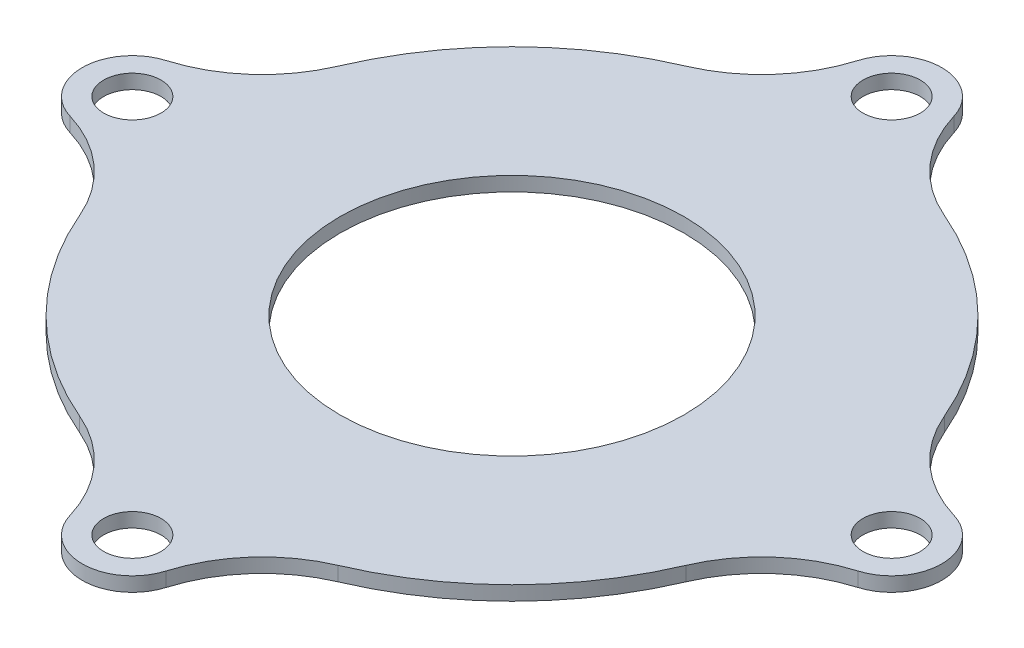
ISO-10303-21;
HEADER;
FILE_DESCRIPTION(('STEP AP214'),'2;1');
FILE_NAME('part.step','',(''),(''),'','','');
FILE_SCHEMA(('AUTOMOTIVE_DESIGN { 1 0 10303 214 1 1 1 1 }'));
ENDSEC;
DATA;
#1=APPLICATION_CONTEXT('core data for automotive mechanical design processes');
#2=APPLICATION_PROTOCOL_DEFINITION('international standard','automotive_design',2000,#1);
#3=PRODUCT_CONTEXT('',#1,'mechanical');
#4=PRODUCT('Part','Part','',(#3));
#5=PRODUCT_RELATED_PRODUCT_CATEGORY('part','',(#4));
#6=PRODUCT_DEFINITION_FORMATION('','',#4);
#7=PRODUCT_DEFINITION_CONTEXT('part definition',#1,'design');
#8=PRODUCT_DEFINITION('design','',#6,#7);
#9=PRODUCT_DEFINITION_SHAPE('','',#8);
#10=(LENGTH_UNIT() NAMED_UNIT(*) SI_UNIT(.MILLI.,.METRE.));
#11=(NAMED_UNIT(*) PLANE_ANGLE_UNIT() SI_UNIT($,.RADIAN.));
#12=(NAMED_UNIT(*) SI_UNIT($,.STERADIAN.) SOLID_ANGLE_UNIT());
#13=UNCERTAINTY_MEASURE_WITH_UNIT(LENGTH_MEASURE(1.E-05),#10,'distance_accuracy_value','');
#14=(GEOMETRIC_REPRESENTATION_CONTEXT(3) GLOBAL_UNCERTAINTY_ASSIGNED_CONTEXT((#13)) GLOBAL_UNIT_ASSIGNED_CONTEXT((#10,
#11,#12)) REPRESENTATION_CONTEXT('',''));
#15=CARTESIAN_POINT('',(0.,0.,0.));
#16=DIRECTION('',(0.,0.,1.));
#17=DIRECTION('',(1.,0.,0.));
#18=AXIS2_PLACEMENT_3D('',#15,#16,#17);
#19=CARTESIAN_POINT('',(0.,3.,0.));
#20=DIRECTION('',(0.,-1.,0.));
#21=DIRECTION('',(0.,0.,-1.));
#22=AXIS2_PLACEMENT_3D('',#19,#20,#21);
#23=CYLINDRICAL_SURFACE('',#22,23.);
#24=CARTESIAN_POINT('',(0.,1.,0.));
#25=DIRECTION('',(0.,1.,0.));
#26=DIRECTION('',(0.,0.,1.));
#27=AXIS2_PLACEMENT_3D('',#24,#25,#26);
#28=CIRCLE('',#27,23.);
#29=CARTESIAN_POINT('',(-21.1589479702687,1.,-9.01659141757354));
#30=VERTEX_POINT('',#29);
#31=CARTESIAN_POINT('',(-9.01659141757377,0.999999999999973,-21.1589479702686));
#32=VERTEX_POINT('',#31);
#33=EDGE_CURVE('E153',#30,#32,#28,.F.);
#34=ORIENTED_EDGE('',*,*,#33,.T.);
#35=DIRECTION('',(0.,-1.,0.));
#36=VECTOR('',#35,1.);
#37=CARTESIAN_POINT('',(-9.01659141757377,3.,-21.1589479702686));
#38=LINE('',#37,#36);
#39=CARTESIAN_POINT('',(-9.01659141757377,0.,-21.1589479702686));
#40=VERTEX_POINT('',#39);
#41=EDGE_CURVE('E166',#32,#40,#38,.T.);
#42=ORIENTED_EDGE('',*,*,#41,.T.);
#43=CARTESIAN_POINT('',(0.,0.,0.));
#44=DIRECTION('',(0.,1.,0.));
#45=DIRECTION('',(0.,0.,1.));
#46=AXIS2_PLACEMENT_3D('',#43,#44,#45);
#47=CIRCLE('',#46,23.);
#48=CARTESIAN_POINT('',(-21.1589479702687,0.,-9.01659141757355));
#49=VERTEX_POINT('',#48);
#50=EDGE_CURVE('E266',#40,#49,#47,.T.);
#51=ORIENTED_EDGE('',*,*,#50,.T.);
#52=DIRECTION('',(0.,-1.,0.));
#53=VECTOR('',#52,1.);
#54=CARTESIAN_POINT('',(-21.1589479702687,3.,-9.01659141757355));
#55=LINE('',#54,#53);
#56=EDGE_CURVE('E169',#49,#30,#55,.F.);
#57=ORIENTED_EDGE('',*,*,#56,.T.);
#58=EDGE_LOOP('',(#34,#42,#51,#57));
#59=FACE_BOUND('',#58,.T.);
#60=ADVANCED_FACE('F38',(#59),#23,.T.);
#61=CARTESIAN_POINT('',(0.,1.,0.));
#62=DIRECTION('',(0.,1.,0.));
#63=DIRECTION('',(0.,0.,1.));
#64=AXIS2_PLACEMENT_3D('',#61,#62,#63);
#65=CIRCLE('',#64,23.);
#66=CARTESIAN_POINT('',(9.01659141757332,1.,-21.1589479702688));
#67=VERTEX_POINT('',#66);
#68=CARTESIAN_POINT('',(21.1589479702687,1.,-9.01659141757369));
#69=VERTEX_POINT('',#68);
#70=EDGE_CURVE('E248',#67,#69,#65,.F.);
#71=ORIENTED_EDGE('',*,*,#70,.T.);
#72=DIRECTION('',(0.,-1.,0.));
#73=VECTOR('',#72,1.);
#74=CARTESIAN_POINT('',(21.1589479702687,3.,-9.0165914175737));
#75=LINE('',#74,#73);
#76=CARTESIAN_POINT('',(21.1589479702687,0.,-9.01659141757369));
#77=VERTEX_POINT('',#76);
#78=EDGE_CURVE('E287',#69,#77,#75,.T.);
#79=ORIENTED_EDGE('',*,*,#78,.T.);
#80=CARTESIAN_POINT('',(9.01659141757333,0.,-21.1589479702688));
#81=VERTEX_POINT('',#80);
#82=EDGE_CURVE('E300',#77,#81,#47,.T.);
#83=ORIENTED_EDGE('',*,*,#82,.T.);
#84=DIRECTION('',(0.,-1.,0.));
#85=VECTOR('',#84,1.);
#86=CARTESIAN_POINT('',(9.01659141757333,3.,-21.1589479702688));
#87=LINE('',#86,#85);
#88=EDGE_CURVE('E284',#81,#67,#87,.F.);
#89=ORIENTED_EDGE('',*,*,#88,.T.);
#90=EDGE_LOOP('',(#71,#79,#83,#89));
#91=FACE_BOUND('',#90,.T.);
#92=ADVANCED_FACE('F321',(#91),#23,.T.);
#93=CARTESIAN_POINT('',(0.,1.,0.));
#94=DIRECTION('',(0.,1.,0.));
#95=DIRECTION('',(0.,0.,1.));
#96=AXIS2_PLACEMENT_3D('',#93,#94,#95);
#97=CIRCLE('',#96,23.);
#98=CARTESIAN_POINT('',(21.1589479702688,1.,9.0165914175734));
#99=VERTEX_POINT('',#98);
#100=CARTESIAN_POINT('',(9.01659141757363,1.,21.1589479702687));
#101=VERTEX_POINT('',#100);
#102=EDGE_CURVE('E236',#99,#101,#97,.F.);
#103=ORIENTED_EDGE('',*,*,#102,.T.);
#104=DIRECTION('',(0.,-1.,0.));
#105=VECTOR('',#104,1.);
#106=CARTESIAN_POINT('',(9.01659141757362,3.,21.1589479702687));
#107=LINE('',#106,#105);
#108=CARTESIAN_POINT('',(9.01659141757362,0.,21.1589479702687));
#109=VERTEX_POINT('',#108);
#110=EDGE_CURVE('E272',#101,#109,#107,.T.);
#111=ORIENTED_EDGE('',*,*,#110,.T.);
#112=CARTESIAN_POINT('',(21.1589479702688,0.,9.0165914175734));
#113=VERTEX_POINT('',#112);
#114=EDGE_CURVE('E269',#109,#113,#47,.T.);
#115=ORIENTED_EDGE('',*,*,#114,.T.);
#116=DIRECTION('',(0.,-1.,0.));
#117=VECTOR('',#116,1.);
#118=CARTESIAN_POINT('',(21.1589479702688,3.,9.0165914175734));
#119=LINE('',#118,#117);
#120=EDGE_CURVE('E268',#113,#99,#119,.F.);
#121=ORIENTED_EDGE('',*,*,#120,.T.);
#122=EDGE_LOOP('',(#103,#111,#115,#121));
#123=FACE_BOUND('',#122,.T.);
#124=ADVANCED_FACE('F306',(#123),#23,.T.);
#125=CARTESIAN_POINT('',(0.,1.,0.));
#126=DIRECTION('',(0.,1.,0.));
#127=DIRECTION('',(0.,0.,1.));
#128=AXIS2_PLACEMENT_3D('',#125,#126,#127);
#129=CIRCLE('',#128,23.);
#130=CARTESIAN_POINT('',(-9.01659141757347,1.,21.1589479702688));
#131=VERTEX_POINT('',#130);
#132=CARTESIAN_POINT('',(-21.1589479702687,1.,9.01659141757353));
#133=VERTEX_POINT('',#132);
#134=EDGE_CURVE('E53',#131,#133,#129,.F.);
#135=ORIENTED_EDGE('',*,*,#134,.T.);
#136=DIRECTION('',(0.,-1.,0.));
#137=VECTOR('',#136,1.);
#138=CARTESIAN_POINT('',(-21.1589479702687,3.,9.01659141757355));
#139=LINE('',#138,#137);
#140=CARTESIAN_POINT('',(-21.1589479702687,0.,9.01659141757355));
#141=VERTEX_POINT('',#140);
#142=EDGE_CURVE('E189',#133,#141,#139,.T.);
#143=ORIENTED_EDGE('',*,*,#142,.T.);
#144=CARTESIAN_POINT('',(-9.01659141757347,0.,21.1589479702688));
#145=VERTEX_POINT('',#144);
#146=EDGE_CURVE('E207',#141,#145,#47,.T.);
#147=ORIENTED_EDGE('',*,*,#146,.T.);
#148=DIRECTION('',(0.,-1.,0.));
#149=VECTOR('',#148,1.);
#150=CARTESIAN_POINT('',(-9.01659141757347,3.,21.1589479702688));
#151=LINE('',#150,#149);
#152=EDGE_CURVE('E186',#145,#131,#151,.F.);
#153=ORIENTED_EDGE('',*,*,#152,.T.);
#154=EDGE_LOOP('',(#135,#143,#147,#153));
#155=FACE_BOUND('',#154,.T.);
#156=ADVANCED_FACE('F328',(#155),#23,.T.);
#157=CARTESIAN_POINT('',(0.,10.,0.));
#158=DIRECTION('',(0.,-1.,0.));
#159=DIRECTION('',(0.,0.,-1.));
#160=AXIS2_PLACEMENT_3D('',#157,#158,#159);
#161=CYLINDRICAL_SURFACE('',#160,12.);
#162=CARTESIAN_POINT('',(0.,0.,0.));
#163=DIRECTION('',(0.,-1.,0.));
#164=DIRECTION('',(0.,0.,-1.));
#165=AXIS2_PLACEMENT_3D('',#162,#163,#164);
#166=CIRCLE('',#165,12.);
#167=CARTESIAN_POINT('',(0.,0.,-12.));
#168=VERTEX_POINT('',#167);
#169=EDGE_CURVE('E216',#168,#168,#166,.T.);
#170=ORIENTED_EDGE('',*,*,#169,.T.);
#171=EDGE_LOOP('',(#170));
#172=FACE_BOUND('',#171,.T.);
#173=CARTESIAN_POINT('',(0.,0.999999999999999,0.));
#174=DIRECTION('',(0.,1.,0.));
#175=DIRECTION('',(0.,0.,1.));
#176=AXIS2_PLACEMENT_3D('',#173,#174,#175);
#177=CIRCLE('',#176,12.);
#178=CARTESIAN_POINT('',(0.,0.999999999999999,12.));
#179=VERTEX_POINT('',#178);
#180=EDGE_CURVE('E161',#179,#179,#177,.F.);
#181=ORIENTED_EDGE('',*,*,#180,.F.);
#182=EDGE_LOOP('',(#181));
#183=FACE_BOUND('',#182,.T.);
#184=ADVANCED_FACE('F360',(#172,#183),#161,.F.);
#185=CARTESIAN_POINT('',(-26.5,3.,0.));
#186=DIRECTION('',(0.,-1.,0.));
#187=DIRECTION('',(0.,0.,-1.));
#188=AXIS2_PLACEMENT_3D('',#185,#186,#187);
#189=CYLINDRICAL_SURFACE('',#188,3.5);
#190=DIRECTION('',(0.,-1.,0.));
#191=VECTOR('',#190,1.);
#192=CARTESIAN_POINT('',(-27.5003494060098,3.,3.35399777368678));
#193=LINE('',#192,#191);
#194=CARTESIAN_POINT('',(-27.5003494060098,0.,3.35399777368678));
#195=VERTEX_POINT('',#194);
#196=CARTESIAN_POINT('',(-27.5003494060098,1.,3.35399777368677));
#197=VERTEX_POINT('',#196);
#198=EDGE_CURVE('E176',#195,#197,#193,.F.);
#199=ORIENTED_EDGE('',*,*,#198,.T.);
#200=CARTESIAN_POINT('',(-26.5,1.,0.));
#201=DIRECTION('',(0.,1.,0.));
#202=DIRECTION('',(0.,0.,1.));
#203=AXIS2_PLACEMENT_3D('',#200,#201,#202);
#204=CIRCLE('',#203,3.5);
#205=CARTESIAN_POINT('',(-27.5003494060098,1.,-3.35399777368678));
#206=VERTEX_POINT('',#205);
#207=EDGE_CURVE('E222',#197,#206,#204,.F.);
#208=ORIENTED_EDGE('',*,*,#207,.T.);
#209=DIRECTION('',(0.,-1.,0.));
#210=VECTOR('',#209,1.);
#211=CARTESIAN_POINT('',(-27.5003494060098,3.,-3.35399777368678));
#212=LINE('',#211,#210);
#213=CARTESIAN_POINT('',(-27.5003494060098,0.,-3.35399777368678));
#214=VERTEX_POINT('',#213);
#215=EDGE_CURVE('E179',#206,#214,#212,.T.);
#216=ORIENTED_EDGE('',*,*,#215,.T.);
#217=CARTESIAN_POINT('',(-26.5,0.,0.));
#218=DIRECTION('',(0.,-1.,0.));
#219=DIRECTION('',(0.,0.,-1.));
#220=AXIS2_PLACEMENT_3D('',#217,#218,#219);
#221=CIRCLE('',#220,3.5);
#222=EDGE_CURVE('E206',#195,#214,#221,.T.);
#223=ORIENTED_EDGE('',*,*,#222,.F.);
#224=EDGE_LOOP('',(#199,#208,#216,#223));
#225=FACE_BOUND('',#224,.T.);
#226=ADVANCED_FACE('F212',(#225),#189,.T.);
#227=CARTESIAN_POINT('',(0.,3.,26.5));
#228=DIRECTION('',(0.,-1.,0.));
#229=DIRECTION('',(0.,0.,-1.));
#230=AXIS2_PLACEMENT_3D('',#227,#228,#229);
#231=CYLINDRICAL_SURFACE('',#230,3.5);
#232=DIRECTION('',(0.,-1.,0.));
#233=VECTOR('',#232,1.);
#234=CARTESIAN_POINT('',(3.35399777368688,3.,27.5003494060098));
#235=LINE('',#234,#233);
#236=CARTESIAN_POINT('',(3.35399777368688,0.,27.5003494060098));
#237=VERTEX_POINT('',#236);
#238=CARTESIAN_POINT('',(3.35399777368688,1.,27.5003494060098));
#239=VERTEX_POINT('',#238);
#240=EDGE_CURVE('E276',#237,#239,#235,.F.);
#241=ORIENTED_EDGE('',*,*,#240,.T.);
#242=CARTESIAN_POINT('',(0.,1.,26.5));
#243=DIRECTION('',(0.,1.,0.));
#244=DIRECTION('',(0.,0.,1.));
#245=AXIS2_PLACEMENT_3D('',#242,#243,#244);
#246=CIRCLE('',#245,3.5);
#247=CARTESIAN_POINT('',(-3.35399777368668,1.,27.5003494060098));
#248=VERTEX_POINT('',#247);
#249=EDGE_CURVE('E230',#239,#248,#246,.F.);
#250=ORIENTED_EDGE('',*,*,#249,.T.);
#251=DIRECTION('',(0.,-1.,0.));
#252=VECTOR('',#251,1.);
#253=CARTESIAN_POINT('',(-3.35399777368668,3.,27.5003494060098));
#254=LINE('',#253,#252);
#255=CARTESIAN_POINT('',(-3.35399777368668,0.,27.5003494060098));
#256=VERTEX_POINT('',#255);
#257=EDGE_CURVE('E274',#248,#256,#254,.T.);
#258=ORIENTED_EDGE('',*,*,#257,.T.);
#259=CARTESIAN_POINT('',(0.,0.,26.5));
#260=DIRECTION('',(0.,-1.,0.));
#261=DIRECTION('',(0.,0.,-1.));
#262=AXIS2_PLACEMENT_3D('',#259,#260,#261);
#263=CIRCLE('',#262,3.5);
#264=EDGE_CURVE('E217',#237,#256,#263,.T.);
#265=ORIENTED_EDGE('',*,*,#264,.F.);
#266=EDGE_LOOP('',(#241,#250,#258,#265));
#267=FACE_BOUND('',#266,.T.);
#268=ADVANCED_FACE('F368',(#267),#231,.T.);
#269=CARTESIAN_POINT('',(26.5,3.,-1.85048510958686E-13));
#270=DIRECTION('',(0.,-1.,0.));
#271=DIRECTION('',(0.,0.,-1.));
#272=AXIS2_PLACEMENT_3D('',#269,#270,#271);
#273=CYLINDRICAL_SURFACE('',#272,3.5);
#274=DIRECTION('',(0.,-1.,0.));
#275=VECTOR('',#274,1.);
#276=CARTESIAN_POINT('',(27.5003494060098,3.,-3.35399777368697));
#277=LINE('',#276,#275);
#278=CARTESIAN_POINT('',(27.5003494060098,0.,-3.35399777368697));
#279=VERTEX_POINT('',#278);
#280=CARTESIAN_POINT('',(27.5003494060098,1.,-3.35399777368697));
#281=VERTEX_POINT('',#280);
#282=EDGE_CURVE('E279',#279,#281,#277,.F.);
#283=ORIENTED_EDGE('',*,*,#282,.T.);
#284=CARTESIAN_POINT('',(26.5,1.,-1.85048510958686E-13));
#285=DIRECTION('',(0.,1.,0.));
#286=DIRECTION('',(0.,0.,1.));
#287=AXIS2_PLACEMENT_3D('',#284,#285,#286);
#288=CIRCLE('',#287,3.5);
#289=CARTESIAN_POINT('',(27.5003494060098,1.,3.35399777368659));
#290=VERTEX_POINT('',#289);
#291=EDGE_CURVE('E242',#281,#290,#288,.F.);
#292=ORIENTED_EDGE('',*,*,#291,.T.);
#293=DIRECTION('',(0.,-1.,0.));
#294=VECTOR('',#293,1.);
#295=CARTESIAN_POINT('',(27.5003494060098,3.,3.35399777368659));
#296=LINE('',#295,#294);
#297=CARTESIAN_POINT('',(27.5003494060098,0.,3.35399777368659));
#298=VERTEX_POINT('',#297);
#299=EDGE_CURVE('E282',#290,#298,#296,.T.);
#300=ORIENTED_EDGE('',*,*,#299,.T.);
#301=CARTESIAN_POINT('',(26.5,0.,-1.85048510958686E-13));
#302=DIRECTION('',(0.,-1.,0.));
#303=DIRECTION('',(0.,0.,-1.));
#304=AXIS2_PLACEMENT_3D('',#301,#302,#303);
#305=CIRCLE('',#304,3.5);
#306=EDGE_CURVE('E260',#279,#298,#305,.T.);
#307=ORIENTED_EDGE('',*,*,#306,.F.);
#308=EDGE_LOOP('',(#283,#292,#300,#307));
#309=FACE_BOUND('',#308,.T.);
#310=ADVANCED_FACE('F314',(#309),#273,.T.);
#311=CARTESIAN_POINT('',(-2.77572766438029E-13,3.,-26.5));
#312=DIRECTION('',(0.,-1.,0.));
#313=DIRECTION('',(0.,0.,-1.));
#314=AXIS2_PLACEMENT_3D('',#311,#312,#313);
#315=CYLINDRICAL_SURFACE('',#314,3.5);
#316=DIRECTION('',(0.,-1.,0.));
#317=VECTOR('',#316,1.);
#318=CARTESIAN_POINT('',(-3.35399777368707,3.,-27.5003494060098));
#319=LINE('',#318,#317);
#320=CARTESIAN_POINT('',(-3.35399777368707,0.,-27.5003494060098));
#321=VERTEX_POINT('',#320);
#322=CARTESIAN_POINT('',(-3.35399777368706,1.,-27.5003494060098));
#323=VERTEX_POINT('',#322);
#324=EDGE_CURVE('E289',#321,#323,#319,.F.);
#325=ORIENTED_EDGE('',*,*,#324,.T.);
#326=CARTESIAN_POINT('',(-2.77572766438029E-13,1.,-26.5));
#327=DIRECTION('',(0.,1.,0.));
#328=DIRECTION('',(0.,0.,1.));
#329=AXIS2_PLACEMENT_3D('',#326,#327,#328);
#330=CIRCLE('',#329,3.5);
#331=CARTESIAN_POINT('',(3.35399777368649,1.,-27.5003494060098));
#332=VERTEX_POINT('',#331);
#333=EDGE_CURVE('E156',#323,#332,#330,.F.);
#334=ORIENTED_EDGE('',*,*,#333,.T.);
#335=DIRECTION('',(0.,-1.,0.));
#336=VECTOR('',#335,1.);
#337=CARTESIAN_POINT('',(3.35399777368649,3.,-27.5003494060098));
#338=LINE('',#337,#336);
#339=CARTESIAN_POINT('',(3.35399777368649,0.,-27.5003494060098));
#340=VERTEX_POINT('',#339);
#341=EDGE_CURVE('E181',#332,#340,#338,.T.);
#342=ORIENTED_EDGE('',*,*,#341,.T.);
#343=CARTESIAN_POINT('',(-2.77572766438029E-13,0.,-26.5));
#344=DIRECTION('',(0.,-1.,0.));
#345=DIRECTION('',(0.,0.,-1.));
#346=AXIS2_PLACEMENT_3D('',#343,#344,#345);
#347=CIRCLE('',#346,3.5);
#348=EDGE_CURVE('E257',#321,#340,#347,.T.);
#349=ORIENTED_EDGE('',*,*,#348,.F.);
#350=EDGE_LOOP('',(#325,#334,#342,#349));
#351=FACE_BOUND('',#350,.T.);
#352=ADVANCED_FACE('F294',(#351),#315,.T.);
#353=CARTESIAN_POINT('',(12.9368485556491,3.,30.3584905660377));
#354=DIRECTION('',(0.,1.,0.));
#355=DIRECTION('',(0.,0.,1.));
#356=AXIS2_PLACEMENT_3D('',#353,#354,#355);
#357=CYLINDRICAL_SURFACE('',#356,10.);
#358=CARTESIAN_POINT('',(12.9368485556491,1.,30.3584905660377));
#359=DIRECTION('',(0.,1.,0.));
#360=DIRECTION('',(0.,0.,1.));
#361=AXIS2_PLACEMENT_3D('',#358,#359,#360);
#362=CIRCLE('',#361,10.);
#363=EDGE_CURVE('E233',#101,#239,#362,.T.);
#364=ORIENTED_EDGE('',*,*,#363,.T.);
#365=ORIENTED_EDGE('',*,*,#240,.F.);
#366=CARTESIAN_POINT('',(12.9368485556491,0.,30.3584905660377));
#367=DIRECTION('',(0.,1.,0.));
#368=DIRECTION('',(0.,0.,1.));
#369=AXIS2_PLACEMENT_3D('',#366,#367,#368);
#370=CIRCLE('',#369,10.);
#371=EDGE_CURVE('E191',#109,#237,#370,.T.);
#372=ORIENTED_EDGE('',*,*,#371,.F.);
#373=ORIENTED_EDGE('',*,*,#110,.F.);
#374=EDGE_LOOP('',(#364,#365,#372,#373));
#375=FACE_BOUND('',#374,.T.);
#376=ADVANCED_FACE('F332',(#375),#357,.F.);
#377=CARTESIAN_POINT('',(30.3584905660378,3.,12.9368485556488));
#378=DIRECTION('',(0.,1.,0.));
#379=DIRECTION('',(0.,0.,1.));
#380=AXIS2_PLACEMENT_3D('',#377,#378,#379);
#381=CYLINDRICAL_SURFACE('',#380,10.);
#382=CARTESIAN_POINT('',(30.3584905660378,1.,12.9368485556488));
#383=DIRECTION('',(0.,1.,0.));
#384=DIRECTION('',(0.,0.,1.));
#385=AXIS2_PLACEMENT_3D('',#382,#383,#384);
#386=CIRCLE('',#385,10.);
#387=EDGE_CURVE('E239',#290,#99,#386,.T.);
#388=ORIENTED_EDGE('',*,*,#387,.T.);
#389=ORIENTED_EDGE('',*,*,#120,.F.);
#390=CARTESIAN_POINT('',(30.3584905660378,0.,12.9368485556488));
#391=DIRECTION('',(0.,1.,0.));
#392=DIRECTION('',(0.,0.,1.));
#393=AXIS2_PLACEMENT_3D('',#390,#391,#392);
#394=CIRCLE('',#393,10.);
#395=EDGE_CURVE('E193',#298,#113,#394,.T.);
#396=ORIENTED_EDGE('',*,*,#395,.F.);
#397=ORIENTED_EDGE('',*,*,#299,.F.);
#398=EDGE_LOOP('',(#388,#389,#396,#397));
#399=FACE_BOUND('',#398,.T.);
#400=ADVANCED_FACE('F311',(#399),#381,.F.);
#401=CARTESIAN_POINT('',(30.3584905660376,3.,-12.9368485556492));
#402=DIRECTION('',(0.,1.,0.));
#403=DIRECTION('',(0.,0.,1.));
#404=AXIS2_PLACEMENT_3D('',#401,#402,#403);
#405=CYLINDRICAL_SURFACE('',#404,10.);
#406=CARTESIAN_POINT('',(30.3584905660376,1.,-12.9368485556492));
#407=DIRECTION('',(0.,1.,0.));
#408=DIRECTION('',(0.,0.,1.));
#409=AXIS2_PLACEMENT_3D('',#406,#407,#408);
#410=CIRCLE('',#409,10.);
#411=EDGE_CURVE('E245',#69,#281,#410,.T.);
#412=ORIENTED_EDGE('',*,*,#411,.T.);
#413=ORIENTED_EDGE('',*,*,#282,.F.);
#414=CARTESIAN_POINT('',(30.3584905660376,0.,-12.9368485556492));
#415=DIRECTION('',(0.,1.,0.));
#416=DIRECTION('',(0.,0.,1.));
#417=AXIS2_PLACEMENT_3D('',#414,#415,#416);
#418=CIRCLE('',#417,10.);
#419=EDGE_CURVE('E195',#77,#279,#418,.T.);
#420=ORIENTED_EDGE('',*,*,#419,.F.);
#421=ORIENTED_EDGE('',*,*,#78,.F.);
#422=EDGE_LOOP('',(#412,#413,#420,#421));
#423=FACE_BOUND('',#422,.T.);
#424=ADVANCED_FACE('F319',(#423),#405,.F.);
#425=CARTESIAN_POINT('',(12.9368485556487,3.,-30.3584905660379));
#426=DIRECTION('',(0.,1.,0.));
#427=DIRECTION('',(0.,0.,1.));
#428=AXIS2_PLACEMENT_3D('',#425,#426,#427);
#429=CYLINDRICAL_SURFACE('',#428,10.);
#430=CARTESIAN_POINT('',(12.9368485556487,1.,-30.3584905660379));
#431=DIRECTION('',(0.,1.,0.));
#432=DIRECTION('',(0.,0.,1.));
#433=AXIS2_PLACEMENT_3D('',#430,#431,#432);
#434=CIRCLE('',#433,10.);
#435=EDGE_CURVE('E251',#332,#67,#434,.T.);
#436=ORIENTED_EDGE('',*,*,#435,.T.);
#437=ORIENTED_EDGE('',*,*,#88,.F.);
#438=CARTESIAN_POINT('',(12.9368485556487,0.,-30.3584905660379));
#439=DIRECTION('',(0.,1.,0.));
#440=DIRECTION('',(0.,0.,1.));
#441=AXIS2_PLACEMENT_3D('',#438,#439,#440);
#442=CIRCLE('',#441,10.);
#443=EDGE_CURVE('E197',#340,#81,#442,.T.);
#444=ORIENTED_EDGE('',*,*,#443,.F.);
#445=ORIENTED_EDGE('',*,*,#341,.F.);
#446=EDGE_LOOP('',(#436,#437,#444,#445));
#447=FACE_BOUND('',#446,.T.);
#448=ADVANCED_FACE('F297',(#447),#429,.F.);
#449=CARTESIAN_POINT('',(-12.9368485556493,3.,-30.3584905660376));
#450=DIRECTION('',(0.,1.,0.));
#451=DIRECTION('',(0.,0.,1.));
#452=AXIS2_PLACEMENT_3D('',#449,#450,#451);
#453=CYLINDRICAL_SURFACE('',#452,10.);
#454=CARTESIAN_POINT('',(-12.9368485556493,1.,-30.3584905660376));
#455=DIRECTION('',(0.,1.,0.));
#456=DIRECTION('',(0.,0.,1.));
#457=AXIS2_PLACEMENT_3D('',#454,#455,#456);
#458=CIRCLE('',#457,10.);
#459=EDGE_CURVE('E149',#32,#323,#458,.T.);
#460=ORIENTED_EDGE('',*,*,#459,.T.);
#461=ORIENTED_EDGE('',*,*,#324,.F.);
#462=CARTESIAN_POINT('',(-12.9368485556493,0.,-30.3584905660376));
#463=DIRECTION('',(0.,1.,0.));
#464=DIRECTION('',(0.,0.,1.));
#465=AXIS2_PLACEMENT_3D('',#462,#463,#464);
#466=CIRCLE('',#465,10.);
#467=EDGE_CURVE('E174',#40,#321,#466,.T.);
#468=ORIENTED_EDGE('',*,*,#467,.F.);
#469=ORIENTED_EDGE('',*,*,#41,.F.);
#470=EDGE_LOOP('',(#460,#461,#468,#469));
#471=FACE_BOUND('',#470,.T.);
#472=ADVANCED_FACE('F173',(#471),#453,.F.);
#473=CARTESIAN_POINT('',(-30.3584905660377,3.,-12.936848555649));
#474=DIRECTION('',(0.,1.,0.));
#475=DIRECTION('',(0.,0.,1.));
#476=AXIS2_PLACEMENT_3D('',#473,#474,#475);
#477=CYLINDRICAL_SURFACE('',#476,10.);
#478=CARTESIAN_POINT('',(-30.3584905660377,1.,-12.936848555649));
#479=DIRECTION('',(0.,1.,0.));
#480=DIRECTION('',(0.,0.,1.));
#481=AXIS2_PLACEMENT_3D('',#478,#479,#480);
#482=CIRCLE('',#481,10.);
#483=EDGE_CURVE('E170',#206,#30,#482,.T.);
#484=ORIENTED_EDGE('',*,*,#483,.T.);
#485=ORIENTED_EDGE('',*,*,#56,.F.);
#486=CARTESIAN_POINT('',(-30.3584905660377,0.,-12.936848555649));
#487=DIRECTION('',(0.,1.,0.));
#488=DIRECTION('',(0.,0.,1.));
#489=AXIS2_PLACEMENT_3D('',#486,#487,#488);
#490=CIRCLE('',#489,10.);
#491=EDGE_CURVE('E200',#214,#49,#490,.T.);
#492=ORIENTED_EDGE('',*,*,#491,.F.);
#493=ORIENTED_EDGE('',*,*,#215,.F.);
#494=EDGE_LOOP('',(#484,#485,#492,#493));
#495=FACE_BOUND('',#494,.T.);
#496=ADVANCED_FACE('F344',(#495),#477,.F.);
#497=CARTESIAN_POINT('',(-30.3584905660377,3.,12.936848555649));
#498=DIRECTION('',(0.,1.,0.));
#499=DIRECTION('',(0.,0.,1.));
#500=AXIS2_PLACEMENT_3D('',#497,#498,#499);
#501=CYLINDRICAL_SURFACE('',#500,10.);
#502=CARTESIAN_POINT('',(-30.3584905660377,1.,12.936848555649));
#503=DIRECTION('',(0.,1.,0.));
#504=DIRECTION('',(0.,0.,1.));
#505=AXIS2_PLACEMENT_3D('',#502,#503,#504);
#506=CIRCLE('',#505,10.);
#507=EDGE_CURVE('E221',#133,#197,#506,.T.);
#508=ORIENTED_EDGE('',*,*,#507,.T.);
#509=ORIENTED_EDGE('',*,*,#198,.F.);
#510=CARTESIAN_POINT('',(-30.3584905660377,0.,12.936848555649));
#511=DIRECTION('',(0.,1.,0.));
#512=DIRECTION('',(0.,0.,1.));
#513=AXIS2_PLACEMENT_3D('',#510,#511,#512);
#514=CIRCLE('',#513,10.);
#515=EDGE_CURVE('E46',#141,#195,#514,.T.);
#516=ORIENTED_EDGE('',*,*,#515,.F.);
#517=ORIENTED_EDGE('',*,*,#142,.F.);
#518=EDGE_LOOP('',(#508,#509,#516,#517));
#519=FACE_BOUND('',#518,.T.);
#520=ADVANCED_FACE('F220',(#519),#501,.F.);
#521=CARTESIAN_POINT('',(-12.9368485556489,3.,30.3584905660378));
#522=DIRECTION('',(0.,1.,0.));
#523=DIRECTION('',(0.,0.,1.));
#524=AXIS2_PLACEMENT_3D('',#521,#522,#523);
#525=CYLINDRICAL_SURFACE('',#524,10.);
#526=CARTESIAN_POINT('',(-12.9368485556489,1.,30.3584905660378));
#527=DIRECTION('',(0.,1.,0.));
#528=DIRECTION('',(0.,0.,1.));
#529=AXIS2_PLACEMENT_3D('',#526,#527,#528);
#530=CIRCLE('',#529,10.);
#531=EDGE_CURVE('E224',#248,#131,#530,.T.);
#532=ORIENTED_EDGE('',*,*,#531,.T.);
#533=ORIENTED_EDGE('',*,*,#152,.F.);
#534=CARTESIAN_POINT('',(-12.9368485556489,0.,30.3584905660378));
#535=DIRECTION('',(0.,1.,0.));
#536=DIRECTION('',(0.,0.,1.));
#537=AXIS2_PLACEMENT_3D('',#534,#535,#536);
#538=CIRCLE('',#537,10.);
#539=EDGE_CURVE('E12',#256,#145,#538,.T.);
#540=ORIENTED_EDGE('',*,*,#539,.F.);
#541=ORIENTED_EDGE('',*,*,#257,.F.);
#542=EDGE_LOOP('',(#532,#533,#540,#541));
#543=FACE_BOUND('',#542,.T.);
#544=ADVANCED_FACE('F40',(#543),#525,.F.);
#545=CARTESIAN_POINT('',(0.,0.,0.));
#546=DIRECTION('',(0.,1.,0.));
#547=DIRECTION('',(0.,0.,1.));
#548=AXIS2_PLACEMENT_3D('',#545,#546,#547);
#549=PLANE('',#548);
#550=ORIENTED_EDGE('',*,*,#169,.F.);
#551=EDGE_LOOP('',(#550));
#552=FACE_BOUND('',#551,.T.);
#553=ORIENTED_EDGE('',*,*,#146,.F.);
#554=ORIENTED_EDGE('',*,*,#515,.T.);
#555=ORIENTED_EDGE('',*,*,#222,.T.);
#556=ORIENTED_EDGE('',*,*,#491,.T.);
#557=ORIENTED_EDGE('',*,*,#50,.F.);
#558=ORIENTED_EDGE('',*,*,#467,.T.);
#559=ORIENTED_EDGE('',*,*,#348,.T.);
#560=ORIENTED_EDGE('',*,*,#443,.T.);
#561=ORIENTED_EDGE('',*,*,#82,.F.);
#562=ORIENTED_EDGE('',*,*,#419,.T.);
#563=ORIENTED_EDGE('',*,*,#306,.T.);
#564=ORIENTED_EDGE('',*,*,#395,.T.);
#565=ORIENTED_EDGE('',*,*,#114,.F.);
#566=ORIENTED_EDGE('',*,*,#371,.T.);
#567=ORIENTED_EDGE('',*,*,#264,.T.);
#568=ORIENTED_EDGE('',*,*,#539,.T.);
#569=EDGE_LOOP('',(#553,#554,#555,#556,#557,#558,#559,#560,#561,#562,#563,#564,#565,#566,#567,#568));
#570=FACE_BOUND('',#569,.T.);
#571=CARTESIAN_POINT('',(4.62621277396715E-13,0.,26.5));
#572=DIRECTION('',(0.,-1.,0.));
#573=DIRECTION('',(0.,0.,-1.));
#574=AXIS2_PLACEMENT_3D('',#571,#572,#573);
#575=CIRCLE('',#574,2.);
#576=CARTESIAN_POINT('',(4.62621277396715E-13,0.,24.5));
#577=VERTEX_POINT('',#576);
#578=EDGE_CURVE('E419',#577,#577,#575,.T.);
#579=ORIENTED_EDGE('',*,*,#578,.F.);
#580=EDGE_LOOP('',(#579));
#581=FACE_BOUND('',#580,.T.);
#582=CARTESIAN_POINT('',(26.5,0.,-5.55145532876058E-13));
#583=DIRECTION('',(0.,-1.,0.));
#584=DIRECTION('',(0.,0.,-1.));
#585=AXIS2_PLACEMENT_3D('',#582,#583,#584);
#586=CIRCLE('',#585,2.);
#587=CARTESIAN_POINT('',(26.5,0.,-2.00000000000056));
#588=VERTEX_POINT('',#587);
#589=EDGE_CURVE('E416',#588,#588,#586,.T.);
#590=ORIENTED_EDGE('',*,*,#589,.F.);
#591=EDGE_LOOP('',(#590));
#592=FACE_BOUND('',#591,.T.);
#593=CARTESIAN_POINT('',(-6.47669788355401E-13,0.,-26.5));
#594=DIRECTION('',(0.,-1.,0.));
#595=DIRECTION('',(0.,0.,-1.));
#596=AXIS2_PLACEMENT_3D('',#593,#594,#595);
#597=CIRCLE('',#596,2.);
#598=CARTESIAN_POINT('',(-6.47669788355401E-13,0.,-28.5));
#599=VERTEX_POINT('',#598);
#600=EDGE_CURVE('E409',#599,#599,#597,.T.);
#601=ORIENTED_EDGE('',*,*,#600,.F.);
#602=EDGE_LOOP('',(#601));
#603=FACE_BOUND('',#602,.T.);
#604=CARTESIAN_POINT('',(-26.5,0.,7.40194043834744E-13));
#605=DIRECTION('',(0.,-1.,0.));
#606=DIRECTION('',(0.,0.,-1.));
#607=AXIS2_PLACEMENT_3D('',#604,#605,#606);
#608=CIRCLE('',#607,2.);
#609=CARTESIAN_POINT('',(-26.5,0.,-1.99999999999926));
#610=VERTEX_POINT('',#609);
#611=EDGE_CURVE('E404',#610,#610,#608,.T.);
#612=ORIENTED_EDGE('',*,*,#611,.F.);
#613=EDGE_LOOP('',(#612));
#614=FACE_BOUND('',#613,.T.);
#615=ADVANCED_FACE('F204',(#552,#570,#581,#592,#603,#614),#549,.F.);
#616=CARTESIAN_POINT('',(0.,1.,0.));
#617=DIRECTION('',(0.,1.,0.));
#618=DIRECTION('',(0.,0.,1.));
#619=AXIS2_PLACEMENT_3D('',#616,#617,#618);
#620=PLANE('',#619);
#621=ORIENTED_EDGE('',*,*,#333,.F.);
#622=ORIENTED_EDGE('',*,*,#459,.F.);
#623=ORIENTED_EDGE('',*,*,#33,.F.);
#624=ORIENTED_EDGE('',*,*,#483,.F.);
#625=ORIENTED_EDGE('',*,*,#207,.F.);
#626=ORIENTED_EDGE('',*,*,#507,.F.);
#627=ORIENTED_EDGE('',*,*,#134,.F.);
#628=ORIENTED_EDGE('',*,*,#531,.F.);
#629=ORIENTED_EDGE('',*,*,#249,.F.);
#630=ORIENTED_EDGE('',*,*,#363,.F.);
#631=ORIENTED_EDGE('',*,*,#102,.F.);
#632=ORIENTED_EDGE('',*,*,#387,.F.);
#633=ORIENTED_EDGE('',*,*,#291,.F.);
#634=ORIENTED_EDGE('',*,*,#411,.F.);
#635=ORIENTED_EDGE('',*,*,#70,.F.);
#636=ORIENTED_EDGE('',*,*,#435,.F.);
#637=EDGE_LOOP('',(#621,#622,#623,#624,#625,#626,#627,#628,#629,#630,#631,#632,#633,#634,#635,#636));
#638=FACE_BOUND('',#637,.T.);
#639=ORIENTED_EDGE('',*,*,#180,.T.);
#640=EDGE_LOOP('',(#639));
#641=FACE_BOUND('',#640,.T.);
#642=CARTESIAN_POINT('',(4.62621277396715E-13,1.,26.5));
#643=DIRECTION('',(0.,-1.,0.));
#644=DIRECTION('',(0.,0.,-1.));
#645=AXIS2_PLACEMENT_3D('',#642,#643,#644);
#646=CIRCLE('',#645,2.);
#647=CARTESIAN_POINT('',(4.62621277396715E-13,1.,24.5));
#648=VERTEX_POINT('',#647);
#649=EDGE_CURVE('E171',#648,#648,#646,.T.);
#650=ORIENTED_EDGE('',*,*,#649,.T.);
#651=EDGE_LOOP('',(#650));
#652=FACE_BOUND('',#651,.T.);
#653=CARTESIAN_POINT('',(26.5,1.,-5.55145532876058E-13));
#654=DIRECTION('',(0.,-1.,0.));
#655=DIRECTION('',(0.,0.,-1.));
#656=AXIS2_PLACEMENT_3D('',#653,#654,#655);
#657=CIRCLE('',#656,2.);
#658=CARTESIAN_POINT('',(26.5,1.,-2.00000000000056));
#659=VERTEX_POINT('',#658);
#660=EDGE_CURVE('E414',#659,#659,#657,.T.);
#661=ORIENTED_EDGE('',*,*,#660,.T.);
#662=EDGE_LOOP('',(#661));
#663=FACE_BOUND('',#662,.T.);
#664=CARTESIAN_POINT('',(-6.47669788355401E-13,1.,-26.5));
#665=DIRECTION('',(0.,-1.,0.));
#666=DIRECTION('',(0.,0.,-1.));
#667=AXIS2_PLACEMENT_3D('',#664,#665,#666);
#668=CIRCLE('',#667,2.);
#669=CARTESIAN_POINT('',(-6.47669788355401E-13,1.,-28.5));
#670=VERTEX_POINT('',#669);
#671=EDGE_CURVE('E406',#670,#670,#668,.T.);
#672=ORIENTED_EDGE('',*,*,#671,.T.);
#673=EDGE_LOOP('',(#672));
#674=FACE_BOUND('',#673,.T.);
#675=CARTESIAN_POINT('',(-26.5,1.,7.40194043834744E-13));
#676=DIRECTION('',(0.,-1.,0.));
#677=DIRECTION('',(0.,0.,-1.));
#678=AXIS2_PLACEMENT_3D('',#675,#676,#677);
#679=CIRCLE('',#678,2.);
#680=CARTESIAN_POINT('',(-26.5,1.,-1.99999999999926));
#681=VERTEX_POINT('',#680);
#682=EDGE_CURVE('E401',#681,#681,#679,.T.);
#683=ORIENTED_EDGE('',*,*,#682,.T.);
#684=EDGE_LOOP('',(#683));
#685=FACE_BOUND('',#684,.T.);
#686=ADVANCED_FACE('F151',(#638,#641,#652,#663,#674,#685),#620,.T.);
#687=CARTESIAN_POINT('',(4.62621277396715E-13,1.,26.5));
#688=DIRECTION('',(0.,-1.,0.));
#689=DIRECTION('',(0.,0.,-1.));
#690=AXIS2_PLACEMENT_3D('',#687,#688,#689);
#691=CYLINDRICAL_SURFACE('',#690,2.);
#692=ORIENTED_EDGE('',*,*,#649,.F.);
#693=EDGE_LOOP('',(#692));
#694=FACE_BOUND('',#693,.T.);
#695=ORIENTED_EDGE('',*,*,#578,.T.);
#696=EDGE_LOOP('',(#695));
#697=FACE_BOUND('',#696,.T.);
#698=ADVANCED_FACE('F381',(#694,#697),#691,.F.);
#699=CARTESIAN_POINT('',(26.5,1.,-5.55145532876058E-13));
#700=DIRECTION('',(0.,-1.,0.));
#701=DIRECTION('',(0.,0.,-1.));
#702=AXIS2_PLACEMENT_3D('',#699,#700,#701);
#703=CYLINDRICAL_SURFACE('',#702,2.);
#704=ORIENTED_EDGE('',*,*,#660,.F.);
#705=EDGE_LOOP('',(#704));
#706=FACE_BOUND('',#705,.T.);
#707=ORIENTED_EDGE('',*,*,#589,.T.);
#708=EDGE_LOOP('',(#707));
#709=FACE_BOUND('',#708,.T.);
#710=ADVANCED_FACE('F384',(#706,#709),#703,.F.);
#711=CARTESIAN_POINT('',(-6.47669788355401E-13,1.,-26.5));
#712=DIRECTION('',(0.,-1.,0.));
#713=DIRECTION('',(0.,0.,-1.));
#714=AXIS2_PLACEMENT_3D('',#711,#712,#713);
#715=CYLINDRICAL_SURFACE('',#714,2.);
#716=ORIENTED_EDGE('',*,*,#671,.F.);
#717=EDGE_LOOP('',(#716));
#718=FACE_BOUND('',#717,.T.);
#719=ORIENTED_EDGE('',*,*,#600,.T.);
#720=EDGE_LOOP('',(#719));
#721=FACE_BOUND('',#720,.T.);
#722=ADVANCED_FACE('F388',(#718,#721),#715,.F.);
#723=CARTESIAN_POINT('',(-26.5,1.,7.40194043834744E-13));
#724=DIRECTION('',(0.,-1.,0.));
#725=DIRECTION('',(0.,0.,-1.));
#726=AXIS2_PLACEMENT_3D('',#723,#724,#725);
#727=CYLINDRICAL_SURFACE('',#726,2.);
#728=ORIENTED_EDGE('',*,*,#682,.F.);
#729=EDGE_LOOP('',(#728));
#730=FACE_BOUND('',#729,.T.);
#731=ORIENTED_EDGE('',*,*,#611,.T.);
#732=EDGE_LOOP('',(#731));
#733=FACE_BOUND('',#732,.T.);
#734=ADVANCED_FACE('F392',(#730,#733),#727,.F.);
#735=CLOSED_SHELL('',(#60,#92,#124,#156,#184,#226,#268,#310,#352,#376,#400,#424,#448,#472,#496,
#520,#544,#615,#686,#698,#710,#722,#734));
#736=MANIFOLD_SOLID_BREP('B2',#735);
#737=ADVANCED_BREP_SHAPE_REPRESENTATION('',(#18,#736),#14);
#738=SHAPE_DEFINITION_REPRESENTATION(#9,#737);
ENDSEC;
END-ISO-10303-21;
